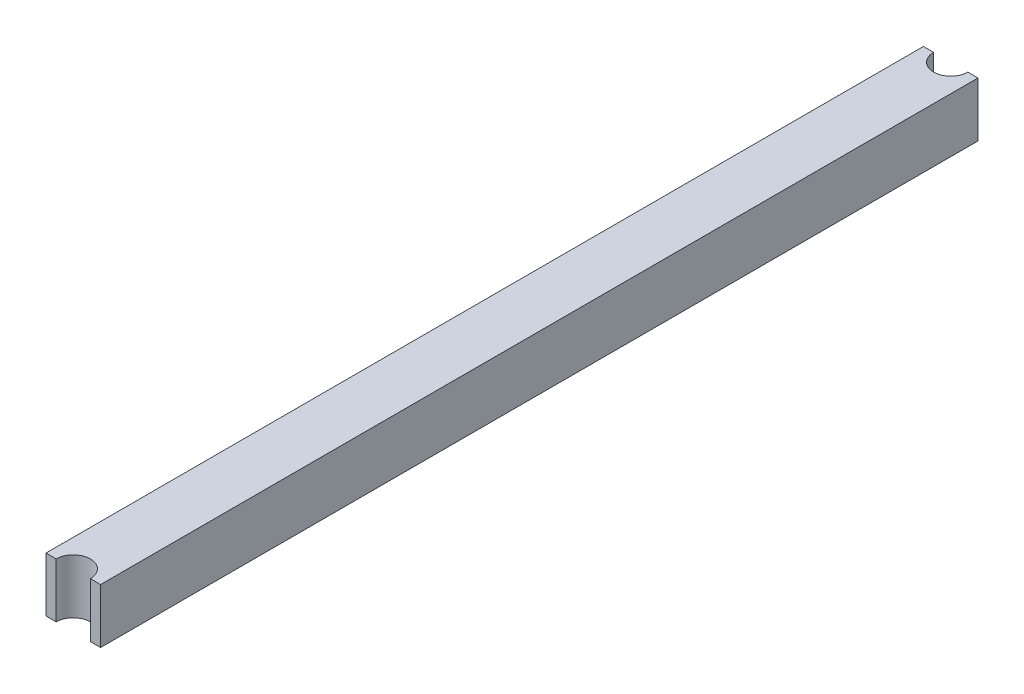
ISO-10303-21;
HEADER;
FILE_DESCRIPTION(('STEP AP214'),'2;1');
FILE_NAME('part.step','',(''),(''),'','','');
FILE_SCHEMA(('AUTOMOTIVE_DESIGN { 1 0 10303 214 1 1 1 1 }'));
ENDSEC;
DATA;
#1=APPLICATION_CONTEXT('core data for automotive mechanical design processes');
#2=APPLICATION_PROTOCOL_DEFINITION('international standard','automotive_design',2000,#1);
#3=PRODUCT_CONTEXT('',#1,'mechanical');
#4=PRODUCT('Part','Part','',(#3));
#5=PRODUCT_RELATED_PRODUCT_CATEGORY('part','',(#4));
#6=PRODUCT_DEFINITION_FORMATION('','',#4);
#7=PRODUCT_DEFINITION_CONTEXT('part definition',#1,'design');
#8=PRODUCT_DEFINITION('design','',#6,#7);
#9=PRODUCT_DEFINITION_SHAPE('','',#8);
#10=(LENGTH_UNIT() NAMED_UNIT(*) SI_UNIT(.MILLI.,.METRE.));
#11=(NAMED_UNIT(*) PLANE_ANGLE_UNIT() SI_UNIT($,.RADIAN.));
#12=(NAMED_UNIT(*) SI_UNIT($,.STERADIAN.) SOLID_ANGLE_UNIT());
#13=UNCERTAINTY_MEASURE_WITH_UNIT(LENGTH_MEASURE(1.E-05),#10,'distance_accuracy_value','');
#14=(GEOMETRIC_REPRESENTATION_CONTEXT(3) GLOBAL_UNCERTAINTY_ASSIGNED_CONTEXT((#13)) GLOBAL_UNIT_ASSIGNED_CONTEXT((#10,
#11,#12)) REPRESENTATION_CONTEXT('',''));
#15=CARTESIAN_POINT('',(0.,0.,0.));
#16=DIRECTION('',(0.,0.,1.));
#17=DIRECTION('',(1.,0.,0.));
#18=AXIS2_PLACEMENT_3D('',#15,#16,#17);
#19=CARTESIAN_POINT('',(0.,0.,500.));
#20=DIRECTION('',(0.,0.,1.));
#21=DIRECTION('',(1.,0.,0.));
#22=AXIS2_PLACEMENT_3D('',#19,#20,#21);
#23=PLANE('',#22);
#24=DIRECTION('',(0.,1.,0.));
#25=VECTOR('',#24,1.);
#26=CARTESIAN_POINT('',(-5.79499999999999,0.,500.));
#27=LINE('',#26,#25);
#28=CARTESIAN_POINT('',(-5.79499999999999,0.,500.));
#29=VERTEX_POINT('',#28);
#30=CARTESIAN_POINT('',(-5.79499999999999,31.1,500.));
#31=VERTEX_POINT('',#30);
#32=EDGE_CURVE('E11',#29,#31,#27,.T.);
#33=ORIENTED_EDGE('',*,*,#32,.F.);
#34=DIRECTION('',(1.,0.,0.));
#35=VECTOR('',#34,1.);
#36=CARTESIAN_POINT('',(-31.1,0.,500.));
#37=LINE('',#36,#35);
#38=CARTESIAN_POINT('',(0.,0.,500.));
#39=VERTEX_POINT('',#38);
#40=EDGE_CURVE('E158',#29,#39,#37,.T.);
#41=ORIENTED_EDGE('',*,*,#40,.T.);
#42=DIRECTION('',(0.,1.,0.));
#43=VECTOR('',#42,1.);
#44=CARTESIAN_POINT('',(0.,31.1,500.));
#45=LINE('',#44,#43);
#46=CARTESIAN_POINT('',(0.,31.1,500.));
#47=VERTEX_POINT('',#46);
#48=EDGE_CURVE('E116',#39,#47,#45,.T.);
#49=ORIENTED_EDGE('',*,*,#48,.T.);
#50=DIRECTION('',(-1.,0.,0.));
#51=VECTOR('',#50,1.);
#52=CARTESIAN_POINT('',(-31.1,31.1,500.));
#53=LINE('',#52,#51);
#54=EDGE_CURVE('E111',#47,#31,#53,.T.);
#55=ORIENTED_EDGE('',*,*,#54,.T.);
#56=EDGE_LOOP('',(#33,#41,#49,#55));
#57=FACE_BOUND('',#56,.T.);
#58=ADVANCED_FACE('F38',(#57),#23,.T.);
#59=CARTESIAN_POINT('',(0.,0.,0.));
#60=DIRECTION('',(0.,0.,1.));
#61=DIRECTION('',(1.,0.,0.));
#62=AXIS2_PLACEMENT_3D('',#59,#60,#61);
#63=PLANE('',#62);
#64=DIRECTION('',(1.,0.,0.));
#65=VECTOR('',#64,1.);
#66=CARTESIAN_POINT('',(-31.1,0.,0.));
#67=LINE('',#66,#65);
#68=CARTESIAN_POINT('',(-5.795,0.,0.));
#69=VERTEX_POINT('',#68);
#70=CARTESIAN_POINT('',(0.,0.,0.));
#71=VERTEX_POINT('',#70);
#72=EDGE_CURVE('E129',#69,#71,#67,.T.);
#73=ORIENTED_EDGE('',*,*,#72,.F.);
#74=DIRECTION('',(0.,1.,0.));
#75=VECTOR('',#74,1.);
#76=CARTESIAN_POINT('',(-5.795,0.,0.));
#77=LINE('',#76,#75);
#78=CARTESIAN_POINT('',(-5.795,31.1,0.));
#79=VERTEX_POINT('',#78);
#80=EDGE_CURVE('E149',#69,#79,#77,.T.);
#81=ORIENTED_EDGE('',*,*,#80,.T.);
#82=DIRECTION('',(-1.,0.,0.));
#83=VECTOR('',#82,1.);
#84=CARTESIAN_POINT('',(-31.1,31.1,0.));
#85=LINE('',#84,#83);
#86=CARTESIAN_POINT('',(0.,31.1,0.));
#87=VERTEX_POINT('',#86);
#88=EDGE_CURVE('E136',#87,#79,#85,.T.);
#89=ORIENTED_EDGE('',*,*,#88,.F.);
#90=DIRECTION('',(0.,1.,0.));
#91=VECTOR('',#90,1.);
#92=CARTESIAN_POINT('',(0.,31.1,0.));
#93=LINE('',#92,#91);
#94=EDGE_CURVE('E133',#71,#87,#93,.T.);
#95=ORIENTED_EDGE('',*,*,#94,.F.);
#96=EDGE_LOOP('',(#73,#81,#89,#95));
#97=FACE_BOUND('',#96,.T.);
#98=ADVANCED_FACE('F170',(#97),#63,.F.);
#99=CARTESIAN_POINT('',(-31.1,31.1,500.));
#100=DIRECTION('',(1.,0.,0.));
#101=DIRECTION('',(0.,1.,0.));
#102=AXIS2_PLACEMENT_3D('',#99,#100,#101);
#103=PLANE('',#102);
#104=DIRECTION('',(0.,-1.,0.));
#105=VECTOR('',#104,1.);
#106=CARTESIAN_POINT('',(-31.1,31.1,0.));
#107=LINE('',#106,#105);
#108=CARTESIAN_POINT('',(-31.1,31.1,0.));
#109=VERTEX_POINT('',#108);
#110=CARTESIAN_POINT('',(-31.1,0.,0.));
#111=VERTEX_POINT('',#110);
#112=EDGE_CURVE('E126',#109,#111,#107,.T.);
#113=ORIENTED_EDGE('',*,*,#112,.T.);
#114=DIRECTION('',(0.,0.,-1.));
#115=VECTOR('',#114,1.);
#116=CARTESIAN_POINT('',(-31.1,0.,500.));
#117=LINE('',#116,#115);
#118=CARTESIAN_POINT('',(-31.1,0.,500.));
#119=VERTEX_POINT('',#118);
#120=EDGE_CURVE('E144',#119,#111,#117,.T.);
#121=ORIENTED_EDGE('',*,*,#120,.F.);
#122=DIRECTION('',(0.,-1.,0.));
#123=VECTOR('',#122,1.);
#124=CARTESIAN_POINT('',(-31.1,31.1,500.));
#125=LINE('',#124,#123);
#126=CARTESIAN_POINT('',(-31.1,31.1,500.));
#127=VERTEX_POINT('',#126);
#128=EDGE_CURVE('E138',#127,#119,#125,.T.);
#129=ORIENTED_EDGE('',*,*,#128,.F.);
#130=DIRECTION('',(0.,0.,-1.));
#131=VECTOR('',#130,1.);
#132=CARTESIAN_POINT('',(-31.1,31.1,500.));
#133=LINE('',#132,#131);
#134=EDGE_CURVE('E118',#127,#109,#133,.T.);
#135=ORIENTED_EDGE('',*,*,#134,.T.);
#136=EDGE_LOOP('',(#113,#121,#129,#135));
#137=FACE_BOUND('',#136,.T.);
#138=ADVANCED_FACE('F40',(#137),#103,.F.);
#139=CARTESIAN_POINT('',(-31.1,0.,500.));
#140=DIRECTION('',(0.,1.,0.));
#141=DIRECTION('',(0.,0.,1.));
#142=AXIS2_PLACEMENT_3D('',#139,#140,#141);
#143=PLANE('',#142);
#144=ORIENTED_EDGE('',*,*,#40,.F.);
#145=CARTESIAN_POINT('',(-15.55,0.,500.));
#146=DIRECTION('',(0.,1.,0.));
#147=DIRECTION('',(0.,0.,1.));
#148=AXIS2_PLACEMENT_3D('',#145,#146,#147);
#149=CIRCLE('',#148,9.75500000000001);
#150=CARTESIAN_POINT('',(-25.305,0.,500.));
#151=VERTEX_POINT('',#150);
#152=EDGE_CURVE('E102',#29,#151,#149,.T.);
#153=ORIENTED_EDGE('',*,*,#152,.T.);
#154=EDGE_CURVE('E155',#119,#151,#37,.T.);
#155=ORIENTED_EDGE('',*,*,#154,.F.);
#156=ORIENTED_EDGE('',*,*,#120,.T.);
#157=CARTESIAN_POINT('',(-25.305,0.,0.));
#158=VERTEX_POINT('',#157);
#159=EDGE_CURVE('E130',#111,#158,#67,.T.);
#160=ORIENTED_EDGE('',*,*,#159,.T.);
#161=CARTESIAN_POINT('',(-15.55,0.,0.));
#162=DIRECTION('',(0.,1.,0.));
#163=DIRECTION('',(0.,0.,1.));
#164=AXIS2_PLACEMENT_3D('',#161,#162,#163);
#165=CIRCLE('',#164,9.755);
#166=EDGE_CURVE('E60',#158,#69,#165,.T.);
#167=ORIENTED_EDGE('',*,*,#166,.T.);
#168=ORIENTED_EDGE('',*,*,#72,.T.);
#169=DIRECTION('',(0.,0.,-1.));
#170=VECTOR('',#169,1.);
#171=CARTESIAN_POINT('',(0.,0.,500.));
#172=LINE('',#171,#170);
#173=EDGE_CURVE('E141',#39,#71,#172,.T.);
#174=ORIENTED_EDGE('',*,*,#173,.F.);
#175=EDGE_LOOP('',(#144,#153,#155,#156,#160,#167,#168,#174));
#176=FACE_BOUND('',#175,.T.);
#177=ADVANCED_FACE('F154',(#176),#143,.F.);
#178=CARTESIAN_POINT('',(0.,31.1,500.));
#179=DIRECTION('',(-1.,0.,0.));
#180=DIRECTION('',(0.,-1.,0.));
#181=AXIS2_PLACEMENT_3D('',#178,#179,#180);
#182=PLANE('',#181);
#183=ORIENTED_EDGE('',*,*,#94,.T.);
#184=DIRECTION('',(0.,0.,-1.));
#185=VECTOR('',#184,1.);
#186=CARTESIAN_POINT('',(0.,31.1,500.));
#187=LINE('',#186,#185);
#188=EDGE_CURVE('E121',#47,#87,#187,.T.);
#189=ORIENTED_EDGE('',*,*,#188,.F.);
#190=ORIENTED_EDGE('',*,*,#48,.F.);
#191=ORIENTED_EDGE('',*,*,#173,.T.);
#192=EDGE_LOOP('',(#183,#189,#190,#191));
#193=FACE_BOUND('',#192,.T.);
#194=ADVANCED_FACE('F173',(#193),#182,.F.);
#195=CARTESIAN_POINT('',(-31.1,31.1,500.));
#196=DIRECTION('',(0.,-1.,0.));
#197=DIRECTION('',(0.,0.,-1.));
#198=AXIS2_PLACEMENT_3D('',#195,#196,#197);
#199=PLANE('',#198);
#200=CARTESIAN_POINT('',(-25.305,31.1,500.));
#201=VERTEX_POINT('',#200);
#202=EDGE_CURVE('E113',#201,#127,#53,.T.);
#203=ORIENTED_EDGE('',*,*,#202,.F.);
#204=CARTESIAN_POINT('',(-15.55,31.1,500.));
#205=DIRECTION('',(0.,1.,0.));
#206=DIRECTION('',(0.,0.,1.));
#207=AXIS2_PLACEMENT_3D('',#204,#205,#206);
#208=CIRCLE('',#207,9.75500000000001);
#209=EDGE_CURVE('E52',#31,#201,#208,.T.);
#210=ORIENTED_EDGE('',*,*,#209,.F.);
#211=ORIENTED_EDGE('',*,*,#54,.F.);
#212=ORIENTED_EDGE('',*,*,#188,.T.);
#213=ORIENTED_EDGE('',*,*,#88,.T.);
#214=CARTESIAN_POINT('',(-15.55,31.1,0.));
#215=DIRECTION('',(0.,1.,0.));
#216=DIRECTION('',(0.,0.,1.));
#217=AXIS2_PLACEMENT_3D('',#214,#215,#216);
#218=CIRCLE('',#217,9.755);
#219=CARTESIAN_POINT('',(-25.305,31.1,0.));
#220=VERTEX_POINT('',#219);
#221=EDGE_CURVE('E159',#220,#79,#218,.T.);
#222=ORIENTED_EDGE('',*,*,#221,.F.);
#223=EDGE_CURVE('E135',#220,#109,#85,.T.);
#224=ORIENTED_EDGE('',*,*,#223,.T.);
#225=ORIENTED_EDGE('',*,*,#134,.F.);
#226=EDGE_LOOP('',(#203,#210,#211,#212,#213,#222,#224,#225));
#227=FACE_BOUND('',#226,.T.);
#228=ADVANCED_FACE('F109',(#227),#199,.F.);
#229=DIRECTION('',(0.,1.,0.));
#230=VECTOR('',#229,1.);
#231=CARTESIAN_POINT('',(-25.305,0.,500.));
#232=LINE('',#231,#230);
#233=EDGE_CURVE('E46',#201,#151,#232,.F.);
#234=ORIENTED_EDGE('',*,*,#233,.F.);
#235=ORIENTED_EDGE('',*,*,#202,.T.);
#236=ORIENTED_EDGE('',*,*,#128,.T.);
#237=ORIENTED_EDGE('',*,*,#154,.T.);
#238=EDGE_LOOP('',(#234,#235,#236,#237));
#239=FACE_BOUND('',#238,.T.);
#240=ADVANCED_FACE('F161',(#239),#23,.T.);
#241=ORIENTED_EDGE('',*,*,#223,.F.);
#242=DIRECTION('',(0.,1.,0.));
#243=VECTOR('',#242,1.);
#244=CARTESIAN_POINT('',(-25.305,0.,0.));
#245=LINE('',#244,#243);
#246=EDGE_CURVE('E147',#220,#158,#245,.F.);
#247=ORIENTED_EDGE('',*,*,#246,.T.);
#248=ORIENTED_EDGE('',*,*,#159,.F.);
#249=ORIENTED_EDGE('',*,*,#112,.F.);
#250=EDGE_LOOP('',(#241,#247,#248,#249));
#251=FACE_BOUND('',#250,.T.);
#252=ADVANCED_FACE('F178',(#251),#63,.F.);
#253=CARTESIAN_POINT('',(-15.55,0.,0.));
#254=DIRECTION('',(0.,1.,0.));
#255=DIRECTION('',(0.,0.,1.));
#256=AXIS2_PLACEMENT_3D('',#253,#254,#255);
#257=CYLINDRICAL_SURFACE('',#256,9.755);
#258=ORIENTED_EDGE('',*,*,#166,.F.);
#259=ORIENTED_EDGE('',*,*,#246,.F.);
#260=ORIENTED_EDGE('',*,*,#221,.T.);
#261=ORIENTED_EDGE('',*,*,#80,.F.);
#262=EDGE_LOOP('',(#258,#259,#260,#261));
#263=FACE_BOUND('',#262,.T.);
#264=ADVANCED_FACE('F199',(#263),#257,.F.);
#265=CARTESIAN_POINT('',(-15.55,0.,500.));
#266=DIRECTION('',(0.,1.,0.));
#267=DIRECTION('',(0.,0.,1.));
#268=AXIS2_PLACEMENT_3D('',#265,#266,#267);
#269=CYLINDRICAL_SURFACE('',#268,9.75500000000001);
#270=ORIENTED_EDGE('',*,*,#32,.T.);
#271=ORIENTED_EDGE('',*,*,#209,.T.);
#272=ORIENTED_EDGE('',*,*,#233,.T.);
#273=ORIENTED_EDGE('',*,*,#152,.F.);
#274=EDGE_LOOP('',(#270,#271,#272,#273));
#275=FACE_BOUND('',#274,.T.);
#276=ADVANCED_FACE('F100',(#275),#269,.F.);
#277=CLOSED_SHELL('',(#58,#98,#138,#177,#194,#228,#240,#252,#264,#276));
#278=MANIFOLD_SOLID_BREP('B2',#277);
#279=ADVANCED_BREP_SHAPE_REPRESENTATION('',(#18,#278),#14);
#280=SHAPE_DEFINITION_REPRESENTATION(#9,#279);
ENDSEC;
END-ISO-10303-21;
